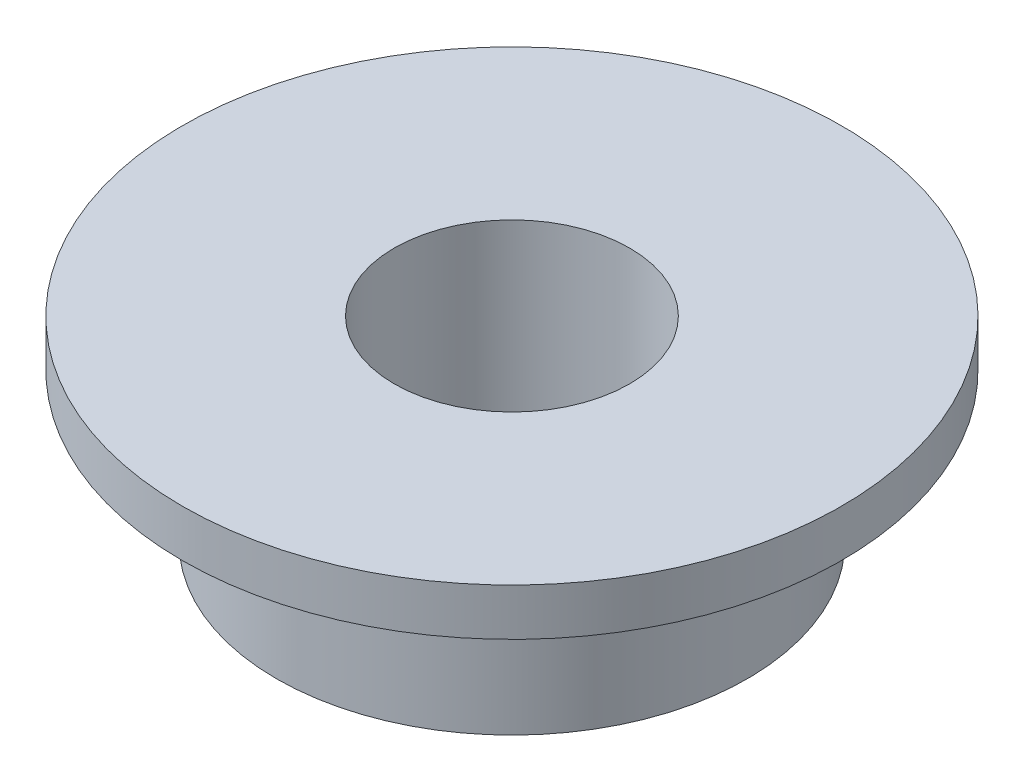
ISO-10303-21;
HEADER;
FILE_DESCRIPTION(('STEP AP214'),'2;1');
FILE_NAME('part.step','',(''),(''),'','','');
FILE_SCHEMA(('AUTOMOTIVE_DESIGN { 1 0 10303 214 1 1 1 1 }'));
ENDSEC;
DATA;
#1=APPLICATION_CONTEXT('core data for automotive mechanical design processes');
#2=APPLICATION_PROTOCOL_DEFINITION('international standard','automotive_design',2000,#1);
#3=PRODUCT_CONTEXT('',#1,'mechanical');
#4=PRODUCT('Part','Part','',(#3));
#5=PRODUCT_RELATED_PRODUCT_CATEGORY('part','',(#4));
#6=PRODUCT_DEFINITION_FORMATION('','',#4);
#7=PRODUCT_DEFINITION_CONTEXT('part definition',#1,'design');
#8=PRODUCT_DEFINITION('design','',#6,#7);
#9=PRODUCT_DEFINITION_SHAPE('','',#8);
#10=(LENGTH_UNIT() NAMED_UNIT(*) SI_UNIT(.MILLI.,.METRE.));
#11=(NAMED_UNIT(*) PLANE_ANGLE_UNIT() SI_UNIT($,.RADIAN.));
#12=(NAMED_UNIT(*) SI_UNIT($,.STERADIAN.) SOLID_ANGLE_UNIT());
#13=UNCERTAINTY_MEASURE_WITH_UNIT(LENGTH_MEASURE(1.E-05),#10,'distance_accuracy_value','');
#14=(GEOMETRIC_REPRESENTATION_CONTEXT(3) GLOBAL_UNCERTAINTY_ASSIGNED_CONTEXT((#13)) GLOBAL_UNIT_ASSIGNED_CONTEXT((#10,
#11,#12)) REPRESENTATION_CONTEXT('',''));
#15=CARTESIAN_POINT('',(0.,0.,0.));
#16=DIRECTION('',(0.,0.,1.));
#17=DIRECTION('',(1.,0.,0.));
#18=AXIS2_PLACEMENT_3D('',#15,#16,#17);
#19=CARTESIAN_POINT('',(0.,-3.175,0.));
#20=DIRECTION('',(0.,1.,0.));
#21=DIRECTION('',(0.,0.,1.));
#22=AXIS2_PLACEMENT_3D('',#19,#20,#21);
#23=CYLINDRICAL_SURFACE('',#22,2.5);
#24=CARTESIAN_POINT('',(0.,-3.175,0.));
#25=DIRECTION('',(0.,1.,0.));
#26=DIRECTION('',(0.,0.,1.));
#27=AXIS2_PLACEMENT_3D('',#24,#25,#26);
#28=CIRCLE('',#27,2.5);
#29=CARTESIAN_POINT('',(0.,-3.175,2.5));
#30=VERTEX_POINT('',#29);
#31=EDGE_CURVE('E45',#30,#30,#28,.T.);
#32=ORIENTED_EDGE('',*,*,#31,.F.);
#33=EDGE_LOOP('',(#32));
#34=FACE_BOUND('',#33,.T.);
#35=CARTESIAN_POINT('',(0.,1.,0.));
#36=DIRECTION('',(0.,1.,0.));
#37=DIRECTION('',(0.,0.,1.));
#38=AXIS2_PLACEMENT_3D('',#35,#36,#37);
#39=CIRCLE('',#38,2.5);
#40=CARTESIAN_POINT('',(0.,1.,2.5));
#41=VERTEX_POINT('',#40);
#42=EDGE_CURVE('E56',#41,#41,#39,.T.);
#43=ORIENTED_EDGE('',*,*,#42,.T.);
#44=EDGE_LOOP('',(#43));
#45=FACE_BOUND('',#44,.T.);
#46=ADVANCED_FACE('F37',(#34,#45),#23,.F.);
#47=CARTESIAN_POINT('',(0.,-3.175,0.));
#48=DIRECTION('',(0.,1.,0.));
#49=DIRECTION('',(0.,0.,1.));
#50=AXIS2_PLACEMENT_3D('',#47,#48,#49);
#51=CYLINDRICAL_SURFACE('',#50,5.);
#52=CARTESIAN_POINT('',(0.,-3.175,0.));
#53=DIRECTION('',(0.,1.,0.));
#54=DIRECTION('',(0.,0.,1.));
#55=AXIS2_PLACEMENT_3D('',#52,#53,#54);
#56=CIRCLE('',#55,5.);
#57=CARTESIAN_POINT('',(0.,-3.175,5.));
#58=VERTEX_POINT('',#57);
#59=EDGE_CURVE('E10',#58,#58,#56,.T.);
#60=ORIENTED_EDGE('',*,*,#59,.T.);
#61=EDGE_LOOP('',(#60));
#62=FACE_BOUND('',#61,.T.);
#63=CARTESIAN_POINT('',(0.,0.,0.));
#64=DIRECTION('',(0.,1.,0.));
#65=DIRECTION('',(0.,0.,1.));
#66=AXIS2_PLACEMENT_3D('',#63,#64,#65);
#67=CIRCLE('',#66,5.);
#68=CARTESIAN_POINT('',(0.,0.,5.));
#69=VERTEX_POINT('',#68);
#70=EDGE_CURVE('E40',#69,#69,#67,.T.);
#71=ORIENTED_EDGE('',*,*,#70,.F.);
#72=EDGE_LOOP('',(#71));
#73=FACE_BOUND('',#72,.T.);
#74=ADVANCED_FACE('F87',(#62,#73),#51,.T.);
#75=CARTESIAN_POINT('',(0.,-3.175,0.));
#76=DIRECTION('',(0.,1.,0.));
#77=DIRECTION('',(0.,0.,1.));
#78=AXIS2_PLACEMENT_3D('',#75,#76,#77);
#79=PLANE('',#78);
#80=ORIENTED_EDGE('',*,*,#31,.T.);
#81=EDGE_LOOP('',(#80));
#82=FACE_BOUND('',#81,.T.);
#83=ORIENTED_EDGE('',*,*,#59,.F.);
#84=EDGE_LOOP('',(#83));
#85=FACE_BOUND('',#84,.T.);
#86=ADVANCED_FACE('F76',(#82,#85),#79,.F.);
#87=CARTESIAN_POINT('',(0.,1.,0.));
#88=DIRECTION('',(0.,-1.,0.));
#89=DIRECTION('',(0.,0.,-1.));
#90=AXIS2_PLACEMENT_3D('',#87,#88,#89);
#91=CYLINDRICAL_SURFACE('',#90,7.);
#92=CARTESIAN_POINT('',(0.,1.,0.));
#93=DIRECTION('',(0.,1.,0.));
#94=DIRECTION('',(0.,0.,1.));
#95=AXIS2_PLACEMENT_3D('',#92,#93,#94);
#96=CIRCLE('',#95,7.);
#97=CARTESIAN_POINT('',(0.,1.,7.));
#98=VERTEX_POINT('',#97);
#99=EDGE_CURVE('E57',#98,#98,#96,.T.);
#100=ORIENTED_EDGE('',*,*,#99,.F.);
#101=EDGE_LOOP('',(#100));
#102=FACE_BOUND('',#101,.T.);
#103=CARTESIAN_POINT('',(0.,0.,0.));
#104=DIRECTION('',(0.,1.,0.));
#105=DIRECTION('',(0.,0.,1.));
#106=AXIS2_PLACEMENT_3D('',#103,#104,#105);
#107=CIRCLE('',#106,7.);
#108=CARTESIAN_POINT('',(0.,0.,7.));
#109=VERTEX_POINT('',#108);
#110=EDGE_CURVE('E52',#109,#109,#107,.T.);
#111=ORIENTED_EDGE('',*,*,#110,.T.);
#112=EDGE_LOOP('',(#111));
#113=FACE_BOUND('',#112,.T.);
#114=ADVANCED_FACE('F70',(#102,#113),#91,.T.);
#115=CARTESIAN_POINT('',(0.,1.,0.));
#116=DIRECTION('',(0.,1.,0.));
#117=DIRECTION('',(0.,0.,1.));
#118=AXIS2_PLACEMENT_3D('',#115,#116,#117);
#119=PLANE('',#118);
#120=ORIENTED_EDGE('',*,*,#42,.F.);
#121=EDGE_LOOP('',(#120));
#122=FACE_BOUND('',#121,.T.);
#123=ORIENTED_EDGE('',*,*,#99,.T.);
#124=EDGE_LOOP('',(#123));
#125=FACE_BOUND('',#124,.T.);
#126=ADVANCED_FACE('F66',(#122,#125),#119,.T.);
#127=CARTESIAN_POINT('',(0.,0.,0.));
#128=DIRECTION('',(0.,1.,0.));
#129=DIRECTION('',(0.,0.,1.));
#130=AXIS2_PLACEMENT_3D('',#127,#128,#129);
#131=PLANE('',#130);
#132=ORIENTED_EDGE('',*,*,#70,.T.);
#133=EDGE_LOOP('',(#132));
#134=FACE_BOUND('',#133,.T.);
#135=ORIENTED_EDGE('',*,*,#110,.F.);
#136=EDGE_LOOP('',(#135));
#137=FACE_BOUND('',#136,.T.);
#138=ADVANCED_FACE('F69',(#134,#137),#131,.F.);
#139=CLOSED_SHELL('',(#46,#74,#86,#114,#126,#138));
#140=MANIFOLD_SOLID_BREP('B2',#139);
#141=ADVANCED_BREP_SHAPE_REPRESENTATION('',(#18,#140),#14);
#142=SHAPE_DEFINITION_REPRESENTATION(#9,#141);
ENDSEC;
END-ISO-10303-21;
